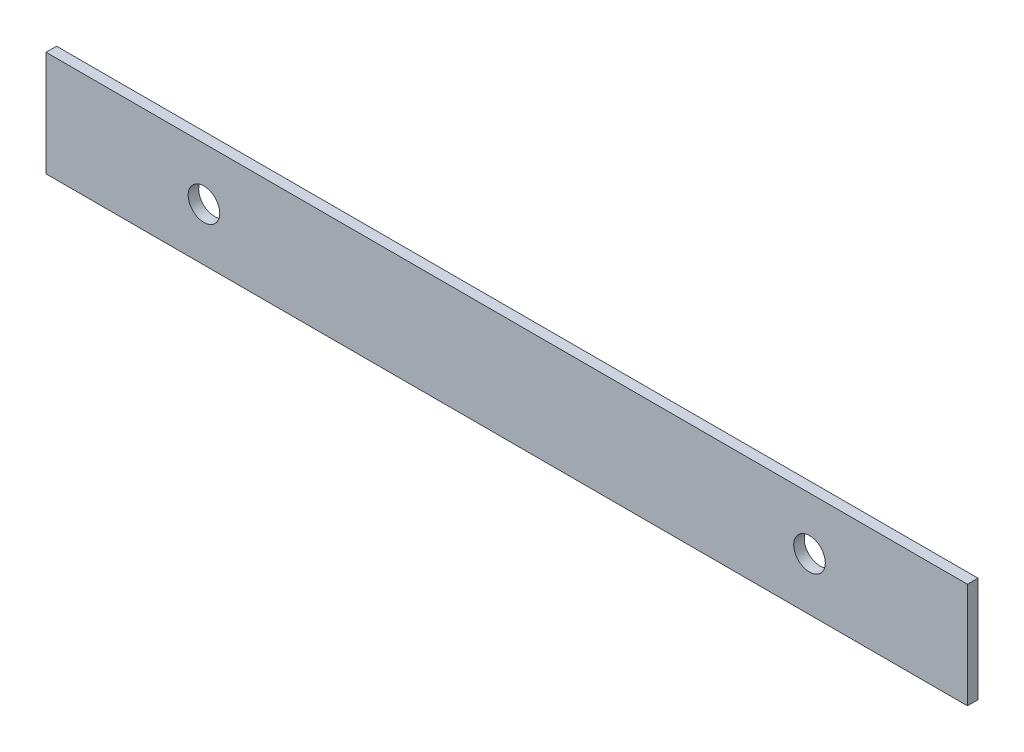
ISO-10303-21;
HEADER;
FILE_DESCRIPTION(('STEP AP214'),'2;1');
FILE_NAME('part.step','',(''),(''),'','','');
FILE_SCHEMA(('AUTOMOTIVE_DESIGN { 1 0 10303 214 1 1 1 1 }'));
ENDSEC;
DATA;
#1=APPLICATION_CONTEXT('core data for automotive mechanical design processes');
#2=APPLICATION_PROTOCOL_DEFINITION('international standard','automotive_design',2000,#1);
#3=PRODUCT_CONTEXT('',#1,'mechanical');
#4=PRODUCT('Part','Part','',(#3));
#5=PRODUCT_RELATED_PRODUCT_CATEGORY('part','',(#4));
#6=PRODUCT_DEFINITION_FORMATION('','',#4);
#7=PRODUCT_DEFINITION_CONTEXT('part definition',#1,'design');
#8=PRODUCT_DEFINITION('design','',#6,#7);
#9=PRODUCT_DEFINITION_SHAPE('','',#8);
#10=(LENGTH_UNIT() NAMED_UNIT(*) SI_UNIT(.MILLI.,.METRE.));
#11=(NAMED_UNIT(*) PLANE_ANGLE_UNIT() SI_UNIT($,.RADIAN.));
#12=(NAMED_UNIT(*) SI_UNIT($,.STERADIAN.) SOLID_ANGLE_UNIT());
#13=UNCERTAINTY_MEASURE_WITH_UNIT(LENGTH_MEASURE(1.E-05),#10,'distance_accuracy_value','');
#14=(GEOMETRIC_REPRESENTATION_CONTEXT(3) GLOBAL_UNCERTAINTY_ASSIGNED_CONTEXT((#13)) GLOBAL_UNIT_ASSIGNED_CONTEXT((#10,
#11,#12)) REPRESENTATION_CONTEXT('',''));
#15=CARTESIAN_POINT('',(0.,0.,0.));
#16=DIRECTION('',(0.,0.,1.));
#17=DIRECTION('',(1.,0.,0.));
#18=AXIS2_PLACEMENT_3D('',#15,#16,#17);
#19=CARTESIAN_POINT('',(0.,0.,4.));
#20=DIRECTION('',(1.,0.,0.));
#21=DIRECTION('',(0.,0.,-1.));
#22=AXIS2_PLACEMENT_3D('',#19,#20,#21);
#23=PLANE('',#22);
#24=DIRECTION('',(0.,-1.,0.));
#25=VECTOR('',#24,1.);
#26=CARTESIAN_POINT('',(0.,0.,0.));
#27=LINE('',#26,#25);
#28=CARTESIAN_POINT('',(0.,40.,0.));
#29=VERTEX_POINT('',#28);
#30=CARTESIAN_POINT('',(0.,0.,0.));
#31=VERTEX_POINT('',#30);
#32=EDGE_CURVE('E107',#29,#31,#27,.T.);
#33=ORIENTED_EDGE('',*,*,#32,.T.);
#34=DIRECTION('',(0.,0.,-1.));
#35=VECTOR('',#34,1.);
#36=CARTESIAN_POINT('',(0.,0.,4.));
#37=LINE('',#36,#35);
#38=CARTESIAN_POINT('',(0.,0.,4.));
#39=VERTEX_POINT('',#38);
#40=EDGE_CURVE('E11',#39,#31,#37,.T.);
#41=ORIENTED_EDGE('',*,*,#40,.F.);
#42=DIRECTION('',(0.,-1.,0.));
#43=VECTOR('',#42,1.);
#44=CARTESIAN_POINT('',(0.,0.,4.));
#45=LINE('',#44,#43);
#46=CARTESIAN_POINT('',(0.,40.,4.));
#47=VERTEX_POINT('',#46);
#48=EDGE_CURVE('E91',#47,#39,#45,.T.);
#49=ORIENTED_EDGE('',*,*,#48,.F.);
#50=DIRECTION('',(0.,0.,-1.));
#51=VECTOR('',#50,1.);
#52=CARTESIAN_POINT('',(0.,40.,4.));
#53=LINE('',#52,#51);
#54=EDGE_CURVE('E103',#47,#29,#53,.T.);
#55=ORIENTED_EDGE('',*,*,#54,.T.);
#56=EDGE_LOOP('',(#33,#41,#49,#55));
#57=FACE_BOUND('',#56,.T.);
#58=ADVANCED_FACE('F39',(#57),#23,.F.);
#59=CARTESIAN_POINT('',(0.,0.,4.));
#60=DIRECTION('',(0.,1.,0.));
#61=DIRECTION('',(0.,0.,1.));
#62=AXIS2_PLACEMENT_3D('',#59,#60,#61);
#63=PLANE('',#62);
#64=DIRECTION('',(1.,0.,0.));
#65=VECTOR('',#64,1.);
#66=CARTESIAN_POINT('',(0.,0.,0.));
#67=LINE('',#66,#65);
#68=CARTESIAN_POINT('',(350.,0.,0.));
#69=VERTEX_POINT('',#68);
#70=EDGE_CURVE('E96',#31,#69,#67,.T.);
#71=ORIENTED_EDGE('',*,*,#70,.T.);
#72=DIRECTION('',(0.,0.,-1.));
#73=VECTOR('',#72,1.);
#74=CARTESIAN_POINT('',(350.,0.,4.));
#75=LINE('',#74,#73);
#76=CARTESIAN_POINT('',(350.,0.,4.));
#77=VERTEX_POINT('',#76);
#78=EDGE_CURVE('E48',#77,#69,#75,.T.);
#79=ORIENTED_EDGE('',*,*,#78,.F.);
#80=DIRECTION('',(1.,0.,0.));
#81=VECTOR('',#80,1.);
#82=CARTESIAN_POINT('',(0.,0.,4.));
#83=LINE('',#82,#81);
#84=EDGE_CURVE('E86',#39,#77,#83,.T.);
#85=ORIENTED_EDGE('',*,*,#84,.F.);
#86=ORIENTED_EDGE('',*,*,#40,.T.);
#87=EDGE_LOOP('',(#71,#79,#85,#86));
#88=FACE_BOUND('',#87,.T.);
#89=ADVANCED_FACE('F95',(#88),#63,.F.);
#90=CARTESIAN_POINT('',(350.,0.,4.));
#91=DIRECTION('',(-1.,0.,0.));
#92=DIRECTION('',(0.,0.,1.));
#93=AXIS2_PLACEMENT_3D('',#90,#91,#92);
#94=PLANE('',#93);
#95=DIRECTION('',(0.,1.,0.));
#96=VECTOR('',#95,1.);
#97=CARTESIAN_POINT('',(350.,0.,0.));
#98=LINE('',#97,#96);
#99=CARTESIAN_POINT('',(350.,40.,0.));
#100=VERTEX_POINT('',#99);
#101=EDGE_CURVE('E73',#69,#100,#98,.T.);
#102=ORIENTED_EDGE('',*,*,#101,.T.);
#103=DIRECTION('',(0.,0.,-1.));
#104=VECTOR('',#103,1.);
#105=CARTESIAN_POINT('',(350.,40.,4.));
#106=LINE('',#105,#104);
#107=CARTESIAN_POINT('',(350.,40.,4.));
#108=VERTEX_POINT('',#107);
#109=EDGE_CURVE('E98',#108,#100,#106,.T.);
#110=ORIENTED_EDGE('',*,*,#109,.F.);
#111=DIRECTION('',(0.,1.,0.));
#112=VECTOR('',#111,1.);
#113=CARTESIAN_POINT('',(350.,0.,4.));
#114=LINE('',#113,#112);
#115=EDGE_CURVE('E89',#77,#108,#114,.T.);
#116=ORIENTED_EDGE('',*,*,#115,.F.);
#117=ORIENTED_EDGE('',*,*,#78,.T.);
#118=EDGE_LOOP('',(#102,#110,#116,#117));
#119=FACE_BOUND('',#118,.T.);
#120=ADVANCED_FACE('F99',(#119),#94,.F.);
#121=CARTESIAN_POINT('',(0.,40.,4.));
#122=DIRECTION('',(0.,-1.,0.));
#123=DIRECTION('',(0.,0.,-1.));
#124=AXIS2_PLACEMENT_3D('',#121,#122,#123);
#125=PLANE('',#124);
#126=DIRECTION('',(-1.,0.,0.));
#127=VECTOR('',#126,1.);
#128=CARTESIAN_POINT('',(0.,40.,0.));
#129=LINE('',#128,#127);
#130=EDGE_CURVE('E79',#100,#29,#129,.T.);
#131=ORIENTED_EDGE('',*,*,#130,.T.);
#132=ORIENTED_EDGE('',*,*,#54,.F.);
#133=DIRECTION('',(-1.,0.,0.));
#134=VECTOR('',#133,1.);
#135=CARTESIAN_POINT('',(0.,40.,4.));
#136=LINE('',#135,#134);
#137=EDGE_CURVE('E56',#108,#47,#136,.T.);
#138=ORIENTED_EDGE('',*,*,#137,.F.);
#139=ORIENTED_EDGE('',*,*,#109,.T.);
#140=EDGE_LOOP('',(#131,#132,#138,#139));
#141=FACE_BOUND('',#140,.T.);
#142=ADVANCED_FACE('F121',(#141),#125,.F.);
#143=CARTESIAN_POINT('',(0.,0.,4.));
#144=DIRECTION('',(0.,0.,-1.));
#145=DIRECTION('',(-1.,0.,0.));
#146=AXIS2_PLACEMENT_3D('',#143,#144,#145);
#147=PLANE('',#146);
#148=CARTESIAN_POINT('',(290.,20.,4.));
#149=DIRECTION('',(0.,0.,1.));
#150=DIRECTION('',(1.,0.,0.));
#151=AXIS2_PLACEMENT_3D('',#148,#149,#150);
#152=CIRCLE('',#151,5.99999999999999);
#153=CARTESIAN_POINT('',(296.,20.,4.));
#154=VERTEX_POINT('',#153);
#155=EDGE_CURVE('E136',#154,#154,#152,.T.);
#156=ORIENTED_EDGE('',*,*,#155,.F.);
#157=EDGE_LOOP('',(#156));
#158=FACE_BOUND('',#157,.T.);
#159=CARTESIAN_POINT('',(60.,20.,4.));
#160=DIRECTION('',(0.,0.,1.));
#161=DIRECTION('',(1.,0.,0.));
#162=AXIS2_PLACEMENT_3D('',#159,#160,#161);
#163=CIRCLE('',#162,5.99999999999999);
#164=CARTESIAN_POINT('',(66.,20.,4.));
#165=VERTEX_POINT('',#164);
#166=EDGE_CURVE('E128',#165,#165,#163,.T.);
#167=ORIENTED_EDGE('',*,*,#166,.F.);
#168=EDGE_LOOP('',(#167));
#169=FACE_BOUND('',#168,.T.);
#170=ORIENTED_EDGE('',*,*,#48,.T.);
#171=ORIENTED_EDGE('',*,*,#84,.T.);
#172=ORIENTED_EDGE('',*,*,#115,.T.);
#173=ORIENTED_EDGE('',*,*,#137,.T.);
#174=EDGE_LOOP('',(#170,#171,#172,#173));
#175=FACE_BOUND('',#174,.T.);
#176=ADVANCED_FACE('F87',(#158,#169,#175),#147,.F.);
#177=CARTESIAN_POINT('',(0.,0.,0.));
#178=DIRECTION('',(0.,0.,-1.));
#179=DIRECTION('',(-1.,0.,0.));
#180=AXIS2_PLACEMENT_3D('',#177,#178,#179);
#181=PLANE('',#180);
#182=CARTESIAN_POINT('',(290.,20.,0.));
#183=DIRECTION('',(0.,0.,1.));
#184=DIRECTION('',(1.,0.,0.));
#185=AXIS2_PLACEMENT_3D('',#182,#183,#184);
#186=CIRCLE('',#185,5.99999999999999);
#187=CARTESIAN_POINT('',(296.,20.,0.));
#188=VERTEX_POINT('',#187);
#189=EDGE_CURVE('E132',#188,#188,#186,.T.);
#190=ORIENTED_EDGE('',*,*,#189,.T.);
#191=EDGE_LOOP('',(#190));
#192=FACE_BOUND('',#191,.T.);
#193=CARTESIAN_POINT('',(60.,20.,0.));
#194=DIRECTION('',(0.,0.,1.));
#195=DIRECTION('',(1.,0.,0.));
#196=AXIS2_PLACEMENT_3D('',#193,#194,#195);
#197=CIRCLE('',#196,5.99999999999999);
#198=CARTESIAN_POINT('',(66.,20.,0.));
#199=VERTEX_POINT('',#198);
#200=EDGE_CURVE('E111',#199,#199,#197,.T.);
#201=ORIENTED_EDGE('',*,*,#200,.T.);
#202=EDGE_LOOP('',(#201));
#203=FACE_BOUND('',#202,.T.);
#204=ORIENTED_EDGE('',*,*,#32,.F.);
#205=ORIENTED_EDGE('',*,*,#130,.F.);
#206=ORIENTED_EDGE('',*,*,#101,.F.);
#207=ORIENTED_EDGE('',*,*,#70,.F.);
#208=EDGE_LOOP('',(#204,#205,#206,#207));
#209=FACE_BOUND('',#208,.T.);
#210=ADVANCED_FACE('F124',(#192,#203,#209),#181,.T.);
#211=CARTESIAN_POINT('',(60.,20.,0.));
#212=DIRECTION('',(0.,0.,1.));
#213=DIRECTION('',(1.,0.,0.));
#214=AXIS2_PLACEMENT_3D('',#211,#212,#213);
#215=CYLINDRICAL_SURFACE('',#214,5.99999999999999);
#216=ORIENTED_EDGE('',*,*,#200,.F.);
#217=EDGE_LOOP('',(#216));
#218=FACE_BOUND('',#217,.T.);
#219=ORIENTED_EDGE('',*,*,#166,.T.);
#220=EDGE_LOOP('',(#219));
#221=FACE_BOUND('',#220,.T.);
#222=ADVANCED_FACE('F149',(#218,#221),#215,.F.);
#223=CARTESIAN_POINT('',(290.,20.,0.));
#224=DIRECTION('',(0.,0.,1.));
#225=DIRECTION('',(1.,0.,0.));
#226=AXIS2_PLACEMENT_3D('',#223,#224,#225);
#227=CYLINDRICAL_SURFACE('',#226,5.99999999999999);
#228=ORIENTED_EDGE('',*,*,#189,.F.);
#229=EDGE_LOOP('',(#228));
#230=FACE_BOUND('',#229,.T.);
#231=ORIENTED_EDGE('',*,*,#155,.T.);
#232=EDGE_LOOP('',(#231));
#233=FACE_BOUND('',#232,.T.);
#234=ADVANCED_FACE('F146',(#230,#233),#227,.F.);
#235=CLOSED_SHELL('',(#58,#89,#120,#142,#176,#210,#222,#234));
#236=MANIFOLD_SOLID_BREP('B2',#235);
#237=ADVANCED_BREP_SHAPE_REPRESENTATION('',(#18,#236),#14);
#238=SHAPE_DEFINITION_REPRESENTATION(#9,#237);
ENDSEC;
END-ISO-10303-21;
